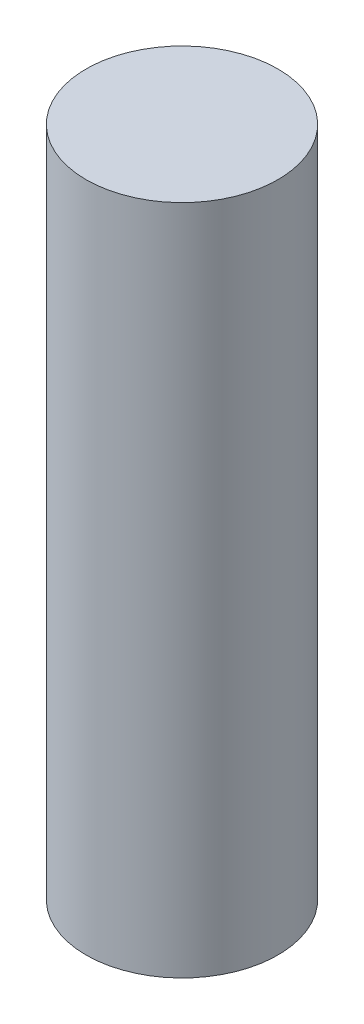
ISO-10303-21;
HEADER;
FILE_DESCRIPTION(('STEP AP214'),'2;1');
FILE_NAME('part.step','',(''),(''),'','','');
FILE_SCHEMA(('AUTOMOTIVE_DESIGN { 1 0 10303 214 1 1 1 1 }'));
ENDSEC;
DATA;
#1=APPLICATION_CONTEXT('core data for automotive mechanical design processes');
#2=APPLICATION_PROTOCOL_DEFINITION('international standard','automotive_design',2000,#1);
#3=PRODUCT_CONTEXT('',#1,'mechanical');
#4=PRODUCT('Part','Part','',(#3));
#5=PRODUCT_RELATED_PRODUCT_CATEGORY('part','',(#4));
#6=PRODUCT_DEFINITION_FORMATION('','',#4);
#7=PRODUCT_DEFINITION_CONTEXT('part definition',#1,'design');
#8=PRODUCT_DEFINITION('design','',#6,#7);
#9=PRODUCT_DEFINITION_SHAPE('','',#8);
#10=(LENGTH_UNIT() NAMED_UNIT(*) SI_UNIT(.MILLI.,.METRE.));
#11=(NAMED_UNIT(*) PLANE_ANGLE_UNIT() SI_UNIT($,.RADIAN.));
#12=(NAMED_UNIT(*) SI_UNIT($,.STERADIAN.) SOLID_ANGLE_UNIT());
#13=UNCERTAINTY_MEASURE_WITH_UNIT(LENGTH_MEASURE(1.E-05),#10,'distance_accuracy_value','');
#14=(GEOMETRIC_REPRESENTATION_CONTEXT(3) GLOBAL_UNCERTAINTY_ASSIGNED_CONTEXT((#13)) GLOBAL_UNIT_ASSIGNED_CONTEXT((#10,
#11,#12)) REPRESENTATION_CONTEXT('',''));
#15=CARTESIAN_POINT('',(0.,0.,0.));
#16=DIRECTION('',(0.,0.,1.));
#17=DIRECTION('',(1.,0.,0.));
#18=AXIS2_PLACEMENT_3D('',#15,#16,#17);
#19=CARTESIAN_POINT('',(0.,70.,0.));
#20=DIRECTION('',(0.,-1.,0.));
#21=DIRECTION('',(0.,0.,-1.));
#22=AXIS2_PLACEMENT_3D('',#19,#20,#21);
#23=CYLINDRICAL_SURFACE('',#22,10.);
#24=CARTESIAN_POINT('',(0.,70.,0.));
#25=DIRECTION('',(0.,1.,0.));
#26=DIRECTION('',(0.,0.,1.));
#27=AXIS2_PLACEMENT_3D('',#24,#25,#26);
#28=CIRCLE('',#27,10.);
#29=CARTESIAN_POINT('',(0.,70.,10.));
#30=VERTEX_POINT('',#29);
#31=EDGE_CURVE('E10',#30,#30,#28,.T.);
#32=ORIENTED_EDGE('',*,*,#31,.F.);
#33=EDGE_LOOP('',(#32));
#34=FACE_BOUND('',#33,.T.);
#35=CARTESIAN_POINT('',(0.,0.,0.));
#36=DIRECTION('',(0.,1.,0.));
#37=DIRECTION('',(0.,0.,1.));
#38=AXIS2_PLACEMENT_3D('',#35,#36,#37);
#39=CIRCLE('',#38,10.);
#40=CARTESIAN_POINT('',(0.,0.,10.));
#41=VERTEX_POINT('',#40);
#42=EDGE_CURVE('E36',#41,#41,#39,.T.);
#43=ORIENTED_EDGE('',*,*,#42,.T.);
#44=EDGE_LOOP('',(#43));
#45=FACE_BOUND('',#44,.T.);
#46=ADVANCED_FACE('F33',(#34,#45),#23,.T.);
#47=CARTESIAN_POINT('',(0.,70.,0.));
#48=DIRECTION('',(0.,1.,0.));
#49=DIRECTION('',(0.,0.,1.));
#50=AXIS2_PLACEMENT_3D('',#47,#48,#49);
#51=PLANE('',#50);
#52=ORIENTED_EDGE('',*,*,#31,.T.);
#53=EDGE_LOOP('',(#52));
#54=FACE_BOUND('',#53,.T.);
#55=ADVANCED_FACE('F48',(#54),#51,.T.);
#56=CARTESIAN_POINT('',(0.,0.,0.));
#57=DIRECTION('',(0.,1.,0.));
#58=DIRECTION('',(0.,0.,1.));
#59=AXIS2_PLACEMENT_3D('',#56,#57,#58);
#60=PLANE('',#59);
#61=ORIENTED_EDGE('',*,*,#42,.F.);
#62=EDGE_LOOP('',(#61));
#63=FACE_BOUND('',#62,.T.);
#64=ADVANCED_FACE('F46',(#63),#60,.F.);
#65=CLOSED_SHELL('',(#46,#55,#64));
#66=MANIFOLD_SOLID_BREP('B2',#65);
#67=ADVANCED_BREP_SHAPE_REPRESENTATION('',(#18,#66),#14);
#68=SHAPE_DEFINITION_REPRESENTATION(#9,#67);
ENDSEC;
END-ISO-10303-21;
